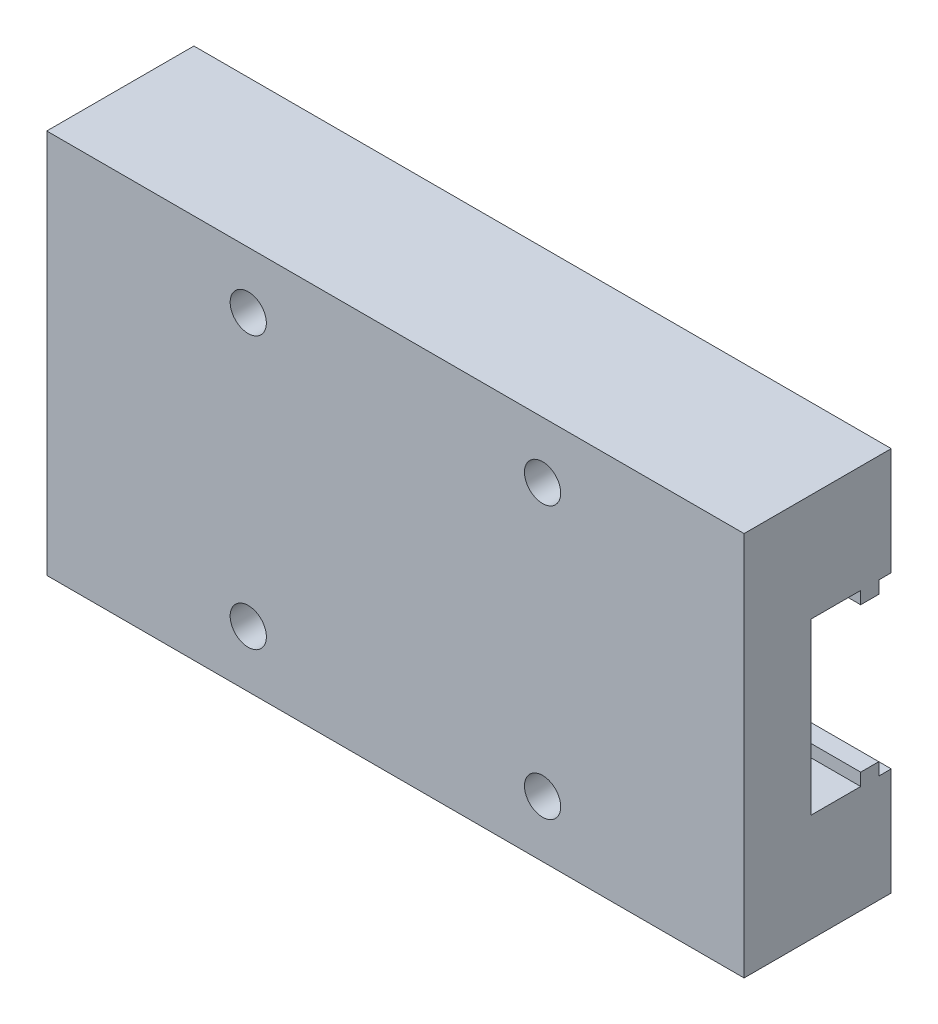
ISO-10303-21;
HEADER;
FILE_DESCRIPTION(('STEP AP214'),'2;1');
FILE_NAME('part.step','',(''),(''),'','','');
FILE_SCHEMA(('AUTOMOTIVE_DESIGN { 1 0 10303 214 1 1 1 1 }'));
ENDSEC;
DATA;
#1=APPLICATION_CONTEXT('core data for automotive mechanical design processes');
#2=APPLICATION_PROTOCOL_DEFINITION('international standard','automotive_design',2000,#1);
#3=PRODUCT_CONTEXT('',#1,'mechanical');
#4=PRODUCT('Part','Part','',(#3));
#5=PRODUCT_RELATED_PRODUCT_CATEGORY('part','',(#4));
#6=PRODUCT_DEFINITION_FORMATION('','',#4);
#7=PRODUCT_DEFINITION_CONTEXT('part definition',#1,'design');
#8=PRODUCT_DEFINITION('design','',#6,#7);
#9=PRODUCT_DEFINITION_SHAPE('','',#8);
#10=(LENGTH_UNIT() NAMED_UNIT(*) SI_UNIT(.MILLI.,.METRE.));
#11=(NAMED_UNIT(*) PLANE_ANGLE_UNIT() SI_UNIT($,.RADIAN.));
#12=(NAMED_UNIT(*) SI_UNIT($,.STERADIAN.) SOLID_ANGLE_UNIT());
#13=UNCERTAINTY_MEASURE_WITH_UNIT(LENGTH_MEASURE(1.E-05),#10,'distance_accuracy_value','');
#14=(GEOMETRIC_REPRESENTATION_CONTEXT(3) GLOBAL_UNCERTAINTY_ASSIGNED_CONTEXT((#13)) GLOBAL_UNIT_ASSIGNED_CONTEXT((#10,
#11,#12)) REPRESENTATION_CONTEXT('',''));
#15=CARTESIAN_POINT('',(0.,0.,0.));
#16=DIRECTION('',(0.,0.,1.));
#17=DIRECTION('',(1.,0.,0.));
#18=AXIS2_PLACEMENT_3D('',#15,#16,#17);
#19=CARTESIAN_POINT('',(-7.,15.25,37.45));
#20=DIRECTION('',(0.,1.,0.));
#21=DIRECTION('',(0.,0.,1.));
#22=AXIS2_PLACEMENT_3D('',#19,#20,#21);
#23=PLANE('',#22);
#24=DIRECTION('',(0.,0.,1.));
#25=VECTOR('',#24,1.);
#26=CARTESIAN_POINT('',(-6.9,15.25,40.4));
#27=LINE('',#26,#25);
#28=CARTESIAN_POINT('',(-6.9,15.25,33.9));
#29=VERTEX_POINT('',#28);
#30=CARTESIAN_POINT('',(-6.9,15.25,34.45));
#31=VERTEX_POINT('',#30);
#32=EDGE_CURVE('E221',#29,#31,#27,.T.);
#33=ORIENTED_EDGE('',*,*,#32,.T.);
#34=DIRECTION('',(1.,0.,0.));
#35=VECTOR('',#34,1.);
#36=CARTESIAN_POINT('',(-7.,15.25,34.45));
#37=LINE('',#36,#35);
#38=CARTESIAN_POINT('',(23.9,15.25,34.45));
#39=VERTEX_POINT('',#38);
#40=EDGE_CURVE('E55',#31,#39,#37,.T.);
#41=ORIENTED_EDGE('',*,*,#40,.T.);
#42=DIRECTION('',(0.,0.,-1.));
#43=VECTOR('',#42,1.);
#44=CARTESIAN_POINT('',(23.9,15.25,40.4));
#45=LINE('',#44,#43);
#46=CARTESIAN_POINT('',(23.9,15.25,33.9));
#47=VERTEX_POINT('',#46);
#48=EDGE_CURVE('E219',#39,#47,#45,.T.);
#49=ORIENTED_EDGE('',*,*,#48,.T.);
#50=DIRECTION('',(-1.,0.,0.));
#51=VECTOR('',#50,1.);
#52=CARTESIAN_POINT('',(0.,15.25,33.9));
#53=LINE('',#52,#51);
#54=EDGE_CURVE('E264',#47,#29,#53,.T.);
#55=ORIENTED_EDGE('',*,*,#54,.T.);
#56=EDGE_LOOP('',(#33,#41,#49,#55));
#57=FACE_BOUND('',#56,.T.);
#58=ADVANCED_FACE('F43',(#57),#23,.T.);
#59=CARTESIAN_POINT('',(24.,22.75,37.45));
#60=DIRECTION('',(0.,-1.,0.));
#61=DIRECTION('',(0.,0.,-1.));
#62=AXIS2_PLACEMENT_3D('',#59,#60,#61);
#63=PLANE('',#62);
#64=DIRECTION('',(0.,0.,1.));
#65=VECTOR('',#64,1.);
#66=CARTESIAN_POINT('',(23.9,22.75,40.4));
#67=LINE('',#66,#65);
#68=CARTESIAN_POINT('',(23.9,22.75,33.9));
#69=VERTEX_POINT('',#68);
#70=CARTESIAN_POINT('',(23.9,22.75,34.45));
#71=VERTEX_POINT('',#70);
#72=EDGE_CURVE('E213',#69,#71,#67,.T.);
#73=ORIENTED_EDGE('',*,*,#72,.T.);
#74=DIRECTION('',(-1.,0.,0.));
#75=VECTOR('',#74,1.);
#76=CARTESIAN_POINT('',(24.,22.75,34.45));
#77=LINE('',#76,#75);
#78=CARTESIAN_POINT('',(-6.9,22.75,34.45));
#79=VERTEX_POINT('',#78);
#80=EDGE_CURVE('E269',#71,#79,#77,.T.);
#81=ORIENTED_EDGE('',*,*,#80,.T.);
#82=DIRECTION('',(0.,0.,-1.));
#83=VECTOR('',#82,1.);
#84=CARTESIAN_POINT('',(-6.9,22.75,40.4));
#85=LINE('',#84,#83);
#86=CARTESIAN_POINT('',(-6.9,22.75,33.9));
#87=VERTEX_POINT('',#86);
#88=EDGE_CURVE('E216',#79,#87,#85,.T.);
#89=ORIENTED_EDGE('',*,*,#88,.T.);
#90=DIRECTION('',(1.,0.,0.));
#91=VECTOR('',#90,1.);
#92=CARTESIAN_POINT('',(0.,22.75,33.9));
#93=LINE('',#92,#91);
#94=EDGE_CURVE('E263',#87,#69,#93,.T.);
#95=ORIENTED_EDGE('',*,*,#94,.T.);
#96=EDGE_LOOP('',(#73,#81,#89,#95));
#97=FACE_BOUND('',#96,.T.);
#98=ADVANCED_FACE('F337',(#97),#63,.T.);
#99=CARTESIAN_POINT('',(-6.9,27.5,40.4));
#100=DIRECTION('',(1.,0.,0.));
#101=DIRECTION('',(0.,0.,-1.));
#102=AXIS2_PLACEMENT_3D('',#99,#100,#101);
#103=PLANE('',#102);
#104=ORIENTED_EDGE('',*,*,#88,.F.);
#105=DIRECTION('',(0.,-1.,0.));
#106=VECTOR('',#105,1.);
#107=CARTESIAN_POINT('',(-6.9,22.85,34.45));
#108=LINE('',#107,#106);
#109=CARTESIAN_POINT('',(-6.9,22.2,34.45));
#110=VERTEX_POINT('',#109);
#111=EDGE_CURVE('E66',#79,#110,#108,.T.);
#112=ORIENTED_EDGE('',*,*,#111,.T.);
#113=DIRECTION('',(0.,0.,-1.));
#114=VECTOR('',#113,1.);
#115=CARTESIAN_POINT('',(-6.9,22.2,35.25));
#116=LINE('',#115,#114);
#117=CARTESIAN_POINT('',(-6.9,22.2,35.25));
#118=VERTEX_POINT('',#117);
#119=EDGE_CURVE('E189',#118,#110,#116,.T.);
#120=ORIENTED_EDGE('',*,*,#119,.F.);
#121=DIRECTION('',(0.,-1.,0.));
#122=VECTOR('',#121,1.);
#123=CARTESIAN_POINT('',(-6.9,22.85,35.25));
#124=LINE('',#123,#122);
#125=CARTESIAN_POINT('',(-6.9,22.75,35.25));
#126=VERTEX_POINT('',#125);
#127=EDGE_CURVE('E199',#126,#118,#124,.T.);
#128=ORIENTED_EDGE('',*,*,#127,.F.);
#129=CARTESIAN_POINT('',(-6.9,22.75,37.45));
#130=VERTEX_POINT('',#129);
#131=EDGE_CURVE('E220',#130,#126,#85,.T.);
#132=ORIENTED_EDGE('',*,*,#131,.F.);
#133=DIRECTION('',(0.,-1.,0.));
#134=VECTOR('',#133,1.);
#135=CARTESIAN_POINT('',(-6.9,27.5,37.45));
#136=LINE('',#135,#134);
#137=CARTESIAN_POINT('',(-6.9,15.25,37.45));
#138=VERTEX_POINT('',#137);
#139=EDGE_CURVE('E230',#130,#138,#136,.T.);
#140=ORIENTED_EDGE('',*,*,#139,.T.);
#141=CARTESIAN_POINT('',(-6.9,15.25,35.25));
#142=VERTEX_POINT('',#141);
#143=EDGE_CURVE('E224',#142,#138,#27,.T.);
#144=ORIENTED_EDGE('',*,*,#143,.F.);
#145=DIRECTION('',(0.,-1.,0.));
#146=VECTOR('',#145,1.);
#147=CARTESIAN_POINT('',(-6.9,15.8,35.25));
#148=LINE('',#147,#146);
#149=CARTESIAN_POINT('',(-6.9,15.8,35.25));
#150=VERTEX_POINT('',#149);
#151=EDGE_CURVE('E167',#150,#142,#148,.T.);
#152=ORIENTED_EDGE('',*,*,#151,.F.);
#153=DIRECTION('',(0.,0.,-1.));
#154=VECTOR('',#153,1.);
#155=CARTESIAN_POINT('',(-6.9,15.8,35.25));
#156=LINE('',#155,#154);
#157=CARTESIAN_POINT('',(-6.9,15.8,34.45));
#158=VERTEX_POINT('',#157);
#159=EDGE_CURVE('E174',#150,#158,#156,.T.);
#160=ORIENTED_EDGE('',*,*,#159,.T.);
#161=DIRECTION('',(0.,-1.,0.));
#162=VECTOR('',#161,1.);
#163=CARTESIAN_POINT('',(-6.9,15.8,34.45));
#164=LINE('',#163,#162);
#165=EDGE_CURVE('E181',#158,#31,#164,.T.);
#166=ORIENTED_EDGE('',*,*,#165,.T.);
#167=ORIENTED_EDGE('',*,*,#32,.F.);
#168=DIRECTION('',(0.,-1.,0.));
#169=VECTOR('',#168,1.);
#170=CARTESIAN_POINT('',(-6.9,27.5,33.9));
#171=LINE('',#170,#169);
#172=CARTESIAN_POINT('',(-6.9,10.5,33.9));
#173=VERTEX_POINT('',#172);
#174=EDGE_CURVE('E226',#29,#173,#171,.T.);
#175=ORIENTED_EDGE('',*,*,#174,.T.);
#176=DIRECTION('',(0.,0.,-1.));
#177=VECTOR('',#176,1.);
#178=CARTESIAN_POINT('',(-6.9,10.5,40.4));
#179=LINE('',#178,#177);
#180=CARTESIAN_POINT('',(-6.9,10.5,40.4));
#181=VERTEX_POINT('',#180);
#182=EDGE_CURVE('E257',#181,#173,#179,.T.);
#183=ORIENTED_EDGE('',*,*,#182,.F.);
#184=DIRECTION('',(0.,-1.,0.));
#185=VECTOR('',#184,1.);
#186=CARTESIAN_POINT('',(-6.9,27.5,40.4));
#187=LINE('',#186,#185);
#188=CARTESIAN_POINT('',(-6.9,27.5,40.4));
#189=VERTEX_POINT('',#188);
#190=EDGE_CURVE('E233',#189,#181,#187,.T.);
#191=ORIENTED_EDGE('',*,*,#190,.F.);
#192=DIRECTION('',(0.,0.,-1.));
#193=VECTOR('',#192,1.);
#194=CARTESIAN_POINT('',(-6.9,27.5,40.4));
#195=LINE('',#194,#193);
#196=CARTESIAN_POINT('',(-6.9,27.5,33.9));
#197=VERTEX_POINT('',#196);
#198=EDGE_CURVE('E242',#189,#197,#195,.T.);
#199=ORIENTED_EDGE('',*,*,#198,.T.);
#200=EDGE_CURVE('E245',#197,#87,#171,.T.);
#201=ORIENTED_EDGE('',*,*,#200,.T.);
#202=EDGE_LOOP('',(#104,#112,#120,#128,#132,#140,#144,#152,#160,#166,#167,#175,#183,#191,#199,#201));
#203=FACE_BOUND('',#202,.T.);
#204=ADVANCED_FACE('F44',(#203),#103,.F.);
#205=CARTESIAN_POINT('',(23.9,10.5,40.4));
#206=DIRECTION('',(-1.,0.,0.));
#207=DIRECTION('',(0.,0.,1.));
#208=AXIS2_PLACEMENT_3D('',#205,#206,#207);
#209=PLANE('',#208);
#210=ORIENTED_EDGE('',*,*,#48,.F.);
#211=DIRECTION('',(0.,1.,0.));
#212=VECTOR('',#211,1.);
#213=CARTESIAN_POINT('',(23.9,15.15,34.45));
#214=LINE('',#213,#212);
#215=CARTESIAN_POINT('',(23.9,15.8,34.45));
#216=VERTEX_POINT('',#215);
#217=EDGE_CURVE('E58',#39,#216,#214,.T.);
#218=ORIENTED_EDGE('',*,*,#217,.T.);
#219=DIRECTION('',(0.,0.,-1.));
#220=VECTOR('',#219,1.);
#221=CARTESIAN_POINT('',(23.9,15.8,35.25));
#222=LINE('',#221,#220);
#223=CARTESIAN_POINT('',(23.9,15.8,35.25));
#224=VERTEX_POINT('',#223);
#225=EDGE_CURVE('E166',#224,#216,#222,.T.);
#226=ORIENTED_EDGE('',*,*,#225,.F.);
#227=DIRECTION('',(0.,1.,0.));
#228=VECTOR('',#227,1.);
#229=CARTESIAN_POINT('',(23.9,15.15,35.25));
#230=LINE('',#229,#228);
#231=CARTESIAN_POINT('',(23.9,15.25,35.25));
#232=VERTEX_POINT('',#231);
#233=EDGE_CURVE('E156',#232,#224,#230,.T.);
#234=ORIENTED_EDGE('',*,*,#233,.F.);
#235=CARTESIAN_POINT('',(23.9,15.25,37.45));
#236=VERTEX_POINT('',#235);
#237=EDGE_CURVE('E222',#236,#232,#45,.T.);
#238=ORIENTED_EDGE('',*,*,#237,.F.);
#239=DIRECTION('',(0.,1.,0.));
#240=VECTOR('',#239,1.);
#241=CARTESIAN_POINT('',(23.9,10.5,37.45));
#242=LINE('',#241,#240);
#243=CARTESIAN_POINT('',(23.9,22.75,37.45));
#244=VERTEX_POINT('',#243);
#245=EDGE_CURVE('E270',#236,#244,#242,.T.);
#246=ORIENTED_EDGE('',*,*,#245,.T.);
#247=CARTESIAN_POINT('',(23.9,22.75,35.25));
#248=VERTEX_POINT('',#247);
#249=EDGE_CURVE('E215',#248,#244,#67,.T.);
#250=ORIENTED_EDGE('',*,*,#249,.F.);
#251=DIRECTION('',(0.,1.,0.));
#252=VECTOR('',#251,1.);
#253=CARTESIAN_POINT('',(23.9,22.2,35.25));
#254=LINE('',#253,#252);
#255=CARTESIAN_POINT('',(23.9,22.2,35.25));
#256=VERTEX_POINT('',#255);
#257=EDGE_CURVE('E194',#256,#248,#254,.T.);
#258=ORIENTED_EDGE('',*,*,#257,.F.);
#259=DIRECTION('',(0.,0.,-1.));
#260=VECTOR('',#259,1.);
#261=CARTESIAN_POINT('',(23.9,22.2,35.25));
#262=LINE('',#261,#260);
#263=CARTESIAN_POINT('',(23.9,22.2,34.45));
#264=VERTEX_POINT('',#263);
#265=EDGE_CURVE('E195',#256,#264,#262,.T.);
#266=ORIENTED_EDGE('',*,*,#265,.T.);
#267=DIRECTION('',(0.,1.,0.));
#268=VECTOR('',#267,1.);
#269=CARTESIAN_POINT('',(23.9,22.2,34.45));
#270=LINE('',#269,#268);
#271=EDGE_CURVE('E198',#264,#71,#270,.T.);
#272=ORIENTED_EDGE('',*,*,#271,.T.);
#273=ORIENTED_EDGE('',*,*,#72,.F.);
#274=DIRECTION('',(0.,1.,0.));
#275=VECTOR('',#274,1.);
#276=CARTESIAN_POINT('',(23.9,10.5,33.9));
#277=LINE('',#276,#275);
#278=CARTESIAN_POINT('',(23.9,27.5,33.9));
#279=VERTEX_POINT('',#278);
#280=EDGE_CURVE('E250',#69,#279,#277,.T.);
#281=ORIENTED_EDGE('',*,*,#280,.T.);
#282=DIRECTION('',(0.,0.,-1.));
#283=VECTOR('',#282,1.);
#284=CARTESIAN_POINT('',(23.9,27.5,40.4));
#285=LINE('',#284,#283);
#286=CARTESIAN_POINT('',(23.9,27.5,40.4));
#287=VERTEX_POINT('',#286);
#288=EDGE_CURVE('E255',#287,#279,#285,.T.);
#289=ORIENTED_EDGE('',*,*,#288,.F.);
#290=DIRECTION('',(0.,1.,0.));
#291=VECTOR('',#290,1.);
#292=CARTESIAN_POINT('',(23.9,10.5,40.4));
#293=LINE('',#292,#291);
#294=CARTESIAN_POINT('',(23.9,10.5,40.4));
#295=VERTEX_POINT('',#294);
#296=EDGE_CURVE('E240',#295,#287,#293,.T.);
#297=ORIENTED_EDGE('',*,*,#296,.F.);
#298=DIRECTION('',(0.,0.,-1.));
#299=VECTOR('',#298,1.);
#300=CARTESIAN_POINT('',(23.9,10.5,40.4));
#301=LINE('',#300,#299);
#302=CARTESIAN_POINT('',(23.9,10.5,33.9));
#303=VERTEX_POINT('',#302);
#304=EDGE_CURVE('E260',#295,#303,#301,.T.);
#305=ORIENTED_EDGE('',*,*,#304,.T.);
#306=EDGE_CURVE('E246',#303,#47,#277,.T.);
#307=ORIENTED_EDGE('',*,*,#306,.T.);
#308=EDGE_LOOP('',(#210,#218,#226,#234,#238,#246,#250,#258,#266,#272,#273,#281,#289,#297,#305,#307));
#309=FACE_BOUND('',#308,.T.);
#310=ADVANCED_FACE('F172',(#309),#209,.F.);
#311=CARTESIAN_POINT('',(0.,0.,33.9));
#312=DIRECTION('',(0.,0.,1.));
#313=DIRECTION('',(1.,0.,0.));
#314=AXIS2_PLACEMENT_3D('',#311,#312,#313);
#315=PLANE('',#314);
#316=ORIENTED_EDGE('',*,*,#54,.F.);
#317=ORIENTED_EDGE('',*,*,#306,.F.);
#318=DIRECTION('',(1.,0.,0.));
#319=VECTOR('',#318,1.);
#320=CARTESIAN_POINT('',(-6.9,10.5,33.9));
#321=LINE('',#320,#319);
#322=EDGE_CURVE('E241',#173,#303,#321,.T.);
#323=ORIENTED_EDGE('',*,*,#322,.F.);
#324=ORIENTED_EDGE('',*,*,#174,.F.);
#325=EDGE_LOOP('',(#316,#317,#323,#324));
#326=FACE_BOUND('',#325,.T.);
#327=ADVANCED_FACE('F357',(#326),#315,.F.);
#328=ORIENTED_EDGE('',*,*,#94,.F.);
#329=ORIENTED_EDGE('',*,*,#200,.F.);
#330=DIRECTION('',(-1.,0.,0.));
#331=VECTOR('',#330,1.);
#332=CARTESIAN_POINT('',(23.9,27.5,33.9));
#333=LINE('',#332,#331);
#334=EDGE_CURVE('E234',#279,#197,#333,.T.);
#335=ORIENTED_EDGE('',*,*,#334,.F.);
#336=ORIENTED_EDGE('',*,*,#280,.F.);
#337=EDGE_LOOP('',(#328,#329,#335,#336));
#338=FACE_BOUND('',#337,.T.);
#339=ADVANCED_FACE('F336',(#338),#315,.F.);
#340=CARTESIAN_POINT('',(-6.9,10.5,40.4));
#341=DIRECTION('',(0.,1.,0.));
#342=DIRECTION('',(0.,0.,1.));
#343=AXIS2_PLACEMENT_3D('',#340,#341,#342);
#344=PLANE('',#343);
#345=ORIENTED_EDGE('',*,*,#322,.T.);
#346=ORIENTED_EDGE('',*,*,#304,.F.);
#347=DIRECTION('',(1.,0.,0.));
#348=VECTOR('',#347,1.);
#349=CARTESIAN_POINT('',(-6.9,10.5,40.4));
#350=LINE('',#349,#348);
#351=EDGE_CURVE('E232',#181,#295,#350,.T.);
#352=ORIENTED_EDGE('',*,*,#351,.F.);
#353=ORIENTED_EDGE('',*,*,#182,.T.);
#354=EDGE_LOOP('',(#345,#346,#352,#353));
#355=FACE_BOUND('',#354,.T.);
#356=ADVANCED_FACE('F354',(#355),#344,.F.);
#357=CARTESIAN_POINT('',(23.9,27.5,40.4));
#358=DIRECTION('',(0.,-1.,0.));
#359=DIRECTION('',(0.,0.,-1.));
#360=AXIS2_PLACEMENT_3D('',#357,#358,#359);
#361=PLANE('',#360);
#362=ORIENTED_EDGE('',*,*,#334,.T.);
#363=ORIENTED_EDGE('',*,*,#198,.F.);
#364=DIRECTION('',(-1.,0.,0.));
#365=VECTOR('',#364,1.);
#366=CARTESIAN_POINT('',(23.9,27.5,40.4));
#367=LINE('',#366,#365);
#368=EDGE_CURVE('E239',#287,#189,#367,.T.);
#369=ORIENTED_EDGE('',*,*,#368,.F.);
#370=ORIENTED_EDGE('',*,*,#288,.T.);
#371=EDGE_LOOP('',(#362,#363,#369,#370));
#372=FACE_BOUND('',#371,.T.);
#373=ADVANCED_FACE('F350',(#372),#361,.F.);
#374=CARTESIAN_POINT('',(0.,0.,40.4));
#375=DIRECTION('',(0.,0.,1.));
#376=DIRECTION('',(1.,0.,0.));
#377=AXIS2_PLACEMENT_3D('',#374,#375,#376);
#378=PLANE('',#377);
#379=CARTESIAN_POINT('',(2.,25.,40.4));
#380=DIRECTION('',(0.,0.,1.));
#381=DIRECTION('',(1.,0.,0.));
#382=AXIS2_PLACEMENT_3D('',#379,#380,#381);
#383=CIRCLE('',#382,0.8);
#384=CARTESIAN_POINT('',(2.8,25.,40.4));
#385=VERTEX_POINT('',#384);
#386=EDGE_CURVE('E50',#385,#385,#383,.F.);
#387=ORIENTED_EDGE('',*,*,#386,.T.);
#388=EDGE_LOOP('',(#387));
#389=FACE_BOUND('',#388,.T.);
#390=CARTESIAN_POINT('',(15.,13.,40.4));
#391=DIRECTION('',(0.,0.,1.));
#392=DIRECTION('',(1.,0.,0.));
#393=AXIS2_PLACEMENT_3D('',#390,#391,#392);
#394=CIRCLE('',#393,0.799999999999999);
#395=CARTESIAN_POINT('',(15.8,13.,40.4));
#396=VERTEX_POINT('',#395);
#397=EDGE_CURVE('E282',#396,#396,#394,.F.);
#398=ORIENTED_EDGE('',*,*,#397,.T.);
#399=EDGE_LOOP('',(#398));
#400=FACE_BOUND('',#399,.T.);
#401=CARTESIAN_POINT('',(15.,25.,40.4));
#402=DIRECTION('',(0.,0.,1.));
#403=DIRECTION('',(1.,0.,0.));
#404=AXIS2_PLACEMENT_3D('',#401,#402,#403);
#405=CIRCLE('',#404,0.799999999999999);
#406=CARTESIAN_POINT('',(15.8,25.,40.4));
#407=VERTEX_POINT('',#406);
#408=EDGE_CURVE('E279',#407,#407,#405,.F.);
#409=ORIENTED_EDGE('',*,*,#408,.T.);
#410=EDGE_LOOP('',(#409));
#411=FACE_BOUND('',#410,.T.);
#412=CARTESIAN_POINT('',(2.,13.,40.4));
#413=DIRECTION('',(0.,0.,1.));
#414=DIRECTION('',(1.,0.,0.));
#415=AXIS2_PLACEMENT_3D('',#412,#413,#414);
#416=CIRCLE('',#415,0.8);
#417=CARTESIAN_POINT('',(2.8,13.,40.4));
#418=VERTEX_POINT('',#417);
#419=EDGE_CURVE('E274',#418,#418,#416,.F.);
#420=ORIENTED_EDGE('',*,*,#419,.T.);
#421=EDGE_LOOP('',(#420));
#422=FACE_BOUND('',#421,.T.);
#423=ORIENTED_EDGE('',*,*,#190,.T.);
#424=ORIENTED_EDGE('',*,*,#351,.T.);
#425=ORIENTED_EDGE('',*,*,#296,.T.);
#426=ORIENTED_EDGE('',*,*,#368,.T.);
#427=EDGE_LOOP('',(#423,#424,#425,#426));
#428=FACE_BOUND('',#427,.T.);
#429=ADVANCED_FACE('F286',(#389,#400,#411,#422,#428),#378,.T.);
#430=CARTESIAN_POINT('',(0.,0.,37.45));
#431=DIRECTION('',(0.,0.,1.));
#432=DIRECTION('',(1.,0.,0.));
#433=AXIS2_PLACEMENT_3D('',#430,#431,#432);
#434=PLANE('',#433);
#435=DIRECTION('',(-1.,0.,0.));
#436=VECTOR('',#435,1.);
#437=CARTESIAN_POINT('',(24.,22.75,37.45));
#438=LINE('',#437,#436);
#439=EDGE_CURVE('E207',#244,#130,#438,.T.);
#440=ORIENTED_EDGE('',*,*,#439,.F.);
#441=ORIENTED_EDGE('',*,*,#245,.F.);
#442=DIRECTION('',(1.,0.,0.));
#443=VECTOR('',#442,1.);
#444=CARTESIAN_POINT('',(-7.,15.25,37.45));
#445=LINE('',#444,#443);
#446=EDGE_CURVE('E173',#138,#236,#445,.T.);
#447=ORIENTED_EDGE('',*,*,#446,.F.);
#448=ORIENTED_EDGE('',*,*,#139,.F.);
#449=EDGE_LOOP('',(#440,#441,#447,#448));
#450=FACE_BOUND('',#449,.T.);
#451=ADVANCED_FACE('F318',(#450),#434,.F.);
#452=DIRECTION('',(1.,0.,0.));
#453=VECTOR('',#452,1.);
#454=CARTESIAN_POINT('',(-7.,15.25,35.25));
#455=LINE('',#454,#453);
#456=EDGE_CURVE('E11',#142,#232,#455,.T.);
#457=ORIENTED_EDGE('',*,*,#456,.F.);
#458=ORIENTED_EDGE('',*,*,#143,.T.);
#459=ORIENTED_EDGE('',*,*,#446,.T.);
#460=ORIENTED_EDGE('',*,*,#237,.T.);
#461=EDGE_LOOP('',(#457,#458,#459,#460));
#462=FACE_BOUND('',#461,.T.);
#463=ADVANCED_FACE('F313',(#462),#23,.T.);
#464=DIRECTION('',(-1.,0.,0.));
#465=VECTOR('',#464,1.);
#466=CARTESIAN_POINT('',(24.,22.75,35.25));
#467=LINE('',#466,#465);
#468=EDGE_CURVE('E275',#248,#126,#467,.T.);
#469=ORIENTED_EDGE('',*,*,#468,.F.);
#470=ORIENTED_EDGE('',*,*,#249,.T.);
#471=ORIENTED_EDGE('',*,*,#439,.T.);
#472=ORIENTED_EDGE('',*,*,#131,.T.);
#473=EDGE_LOOP('',(#469,#470,#471,#472));
#474=FACE_BOUND('',#473,.T.);
#475=ADVANCED_FACE('F321',(#474),#63,.T.);
#476=CARTESIAN_POINT('',(-6.9,22.2,35.25));
#477=DIRECTION('',(0.,1.,0.));
#478=DIRECTION('',(0.,0.,1.));
#479=AXIS2_PLACEMENT_3D('',#476,#477,#478);
#480=PLANE('',#479);
#481=DIRECTION('',(1.,0.,0.));
#482=VECTOR('',#481,1.);
#483=CARTESIAN_POINT('',(-6.9,22.2,34.45));
#484=LINE('',#483,#482);
#485=EDGE_CURVE('E200',#110,#264,#484,.T.);
#486=ORIENTED_EDGE('',*,*,#485,.T.);
#487=ORIENTED_EDGE('',*,*,#265,.F.);
#488=DIRECTION('',(1.,0.,0.));
#489=VECTOR('',#488,1.);
#490=CARTESIAN_POINT('',(-6.9,22.2,35.25));
#491=LINE('',#490,#489);
#492=EDGE_CURVE('E204',#118,#256,#491,.T.);
#493=ORIENTED_EDGE('',*,*,#492,.F.);
#494=ORIENTED_EDGE('',*,*,#119,.T.);
#495=EDGE_LOOP('',(#486,#487,#493,#494));
#496=FACE_BOUND('',#495,.T.);
#497=ADVANCED_FACE('F332',(#496),#480,.F.);
#498=CARTESIAN_POINT('',(0.,0.,35.25));
#499=DIRECTION('',(0.,0.,1.));
#500=DIRECTION('',(1.,0.,0.));
#501=AXIS2_PLACEMENT_3D('',#498,#499,#500);
#502=PLANE('',#501);
#503=ORIENTED_EDGE('',*,*,#257,.T.);
#504=ORIENTED_EDGE('',*,*,#468,.T.);
#505=ORIENTED_EDGE('',*,*,#127,.T.);
#506=ORIENTED_EDGE('',*,*,#492,.T.);
#507=EDGE_LOOP('',(#503,#504,#505,#506));
#508=FACE_BOUND('',#507,.T.);
#509=ADVANCED_FACE('F330',(#508),#502,.T.);
#510=CARTESIAN_POINT('',(0.,0.,34.45));
#511=DIRECTION('',(0.,0.,1.));
#512=DIRECTION('',(1.,0.,0.));
#513=AXIS2_PLACEMENT_3D('',#510,#511,#512);
#514=PLANE('',#513);
#515=ORIENTED_EDGE('',*,*,#80,.F.);
#516=ORIENTED_EDGE('',*,*,#271,.F.);
#517=ORIENTED_EDGE('',*,*,#485,.F.);
#518=ORIENTED_EDGE('',*,*,#111,.F.);
#519=EDGE_LOOP('',(#515,#516,#517,#518));
#520=FACE_BOUND('',#519,.T.);
#521=ADVANCED_FACE('F335',(#520),#514,.F.);
#522=CARTESIAN_POINT('',(23.9,15.8,35.25));
#523=DIRECTION('',(0.,-1.,0.));
#524=DIRECTION('',(0.,0.,-1.));
#525=AXIS2_PLACEMENT_3D('',#522,#523,#524);
#526=PLANE('',#525);
#527=DIRECTION('',(-1.,0.,0.));
#528=VECTOR('',#527,1.);
#529=CARTESIAN_POINT('',(23.9,15.8,34.45));
#530=LINE('',#529,#528);
#531=EDGE_CURVE('E190',#216,#158,#530,.T.);
#532=ORIENTED_EDGE('',*,*,#531,.T.);
#533=ORIENTED_EDGE('',*,*,#159,.F.);
#534=DIRECTION('',(-1.,0.,0.));
#535=VECTOR('',#534,1.);
#536=CARTESIAN_POINT('',(23.9,15.8,35.25));
#537=LINE('',#536,#535);
#538=EDGE_CURVE('E159',#224,#150,#537,.T.);
#539=ORIENTED_EDGE('',*,*,#538,.F.);
#540=ORIENTED_EDGE('',*,*,#225,.T.);
#541=EDGE_LOOP('',(#532,#533,#539,#540));
#542=FACE_BOUND('',#541,.T.);
#543=ADVANCED_FACE('F178',(#542),#526,.F.);
#544=CARTESIAN_POINT('',(0.,0.,35.25));
#545=DIRECTION('',(0.,0.,1.));
#546=DIRECTION('',(1.,0.,0.));
#547=AXIS2_PLACEMENT_3D('',#544,#545,#546);
#548=PLANE('',#547);
#549=ORIENTED_EDGE('',*,*,#151,.T.);
#550=ORIENTED_EDGE('',*,*,#456,.T.);
#551=ORIENTED_EDGE('',*,*,#233,.T.);
#552=ORIENTED_EDGE('',*,*,#538,.T.);
#553=EDGE_LOOP('',(#549,#550,#551,#552));
#554=FACE_BOUND('',#553,.T.);
#555=ADVANCED_FACE('F158',(#554),#548,.T.);
#556=CARTESIAN_POINT('',(0.,0.,34.45));
#557=DIRECTION('',(0.,0.,1.));
#558=DIRECTION('',(1.,0.,0.));
#559=AXIS2_PLACEMENT_3D('',#556,#557,#558);
#560=PLANE('',#559);
#561=ORIENTED_EDGE('',*,*,#40,.F.);
#562=ORIENTED_EDGE('',*,*,#165,.F.);
#563=ORIENTED_EDGE('',*,*,#531,.F.);
#564=ORIENTED_EDGE('',*,*,#217,.F.);
#565=EDGE_LOOP('',(#561,#562,#563,#564));
#566=FACE_BOUND('',#565,.T.);
#567=ADVANCED_FACE('F361',(#566),#560,.F.);
#568=CARTESIAN_POINT('',(2.,13.,40.5));
#569=DIRECTION('',(0.,0.,-1.));
#570=DIRECTION('',(-1.,0.,0.));
#571=AXIS2_PLACEMENT_3D('',#568,#569,#570);
#572=CYLINDRICAL_SURFACE('',#571,0.8);
#573=ORIENTED_EDGE('',*,*,#419,.F.);
#574=EDGE_LOOP('',(#573));
#575=FACE_BOUND('',#574,.T.);
#576=CARTESIAN_POINT('',(2.,13.,37.9));
#577=DIRECTION('',(0.,0.,1.));
#578=DIRECTION('',(1.,0.,0.));
#579=AXIS2_PLACEMENT_3D('',#576,#577,#578);
#580=CIRCLE('',#579,0.8);
#581=CARTESIAN_POINT('',(2.8,13.,37.9));
#582=VERTEX_POINT('',#581);
#583=EDGE_CURVE('E276',#582,#582,#580,.T.);
#584=ORIENTED_EDGE('',*,*,#583,.F.);
#585=EDGE_LOOP('',(#584));
#586=FACE_BOUND('',#585,.T.);
#587=ADVANCED_FACE('F364',(#575,#586),#572,.F.);
#588=CARTESIAN_POINT('',(2.,13.,37.9));
#589=DIRECTION('',(0.,0.,1.));
#590=DIRECTION('',(1.,0.,0.));
#591=AXIS2_PLACEMENT_3D('',#588,#589,#590);
#592=PLANE('',#591);
#593=ORIENTED_EDGE('',*,*,#583,.T.);
#594=EDGE_LOOP('',(#593));
#595=FACE_BOUND('',#594,.T.);
#596=ADVANCED_FACE('F375',(#595),#592,.T.);
#597=CARTESIAN_POINT('',(15.,25.,40.5));
#598=DIRECTION('',(0.,0.,-1.));
#599=DIRECTION('',(-1.,0.,0.));
#600=AXIS2_PLACEMENT_3D('',#597,#598,#599);
#601=CYLINDRICAL_SURFACE('',#600,0.799999999999999);
#602=ORIENTED_EDGE('',*,*,#408,.F.);
#603=EDGE_LOOP('',(#602));
#604=FACE_BOUND('',#603,.T.);
#605=CARTESIAN_POINT('',(15.,25.,37.9));
#606=DIRECTION('',(0.,0.,1.));
#607=DIRECTION('',(1.,0.,0.));
#608=AXIS2_PLACEMENT_3D('',#605,#606,#607);
#609=CIRCLE('',#608,0.799999999999999);
#610=CARTESIAN_POINT('',(15.8,25.,37.9));
#611=VERTEX_POINT('',#610);
#612=EDGE_CURVE('E304',#611,#611,#609,.T.);
#613=ORIENTED_EDGE('',*,*,#612,.F.);
#614=EDGE_LOOP('',(#613));
#615=FACE_BOUND('',#614,.T.);
#616=ADVANCED_FACE('F429',(#604,#615),#601,.F.);
#617=CARTESIAN_POINT('',(15.,25.,37.9));
#618=DIRECTION('',(0.,0.,1.));
#619=DIRECTION('',(1.,0.,0.));
#620=AXIS2_PLACEMENT_3D('',#617,#618,#619);
#621=PLANE('',#620);
#622=ORIENTED_EDGE('',*,*,#612,.T.);
#623=EDGE_LOOP('',(#622));
#624=FACE_BOUND('',#623,.T.);
#625=ADVANCED_FACE('F439',(#624),#621,.T.);
#626=CARTESIAN_POINT('',(15.,13.,40.5));
#627=DIRECTION('',(0.,0.,-1.));
#628=DIRECTION('',(-1.,0.,0.));
#629=AXIS2_PLACEMENT_3D('',#626,#627,#628);
#630=CYLINDRICAL_SURFACE('',#629,0.799999999999999);
#631=ORIENTED_EDGE('',*,*,#397,.F.);
#632=EDGE_LOOP('',(#631));
#633=FACE_BOUND('',#632,.T.);
#634=CARTESIAN_POINT('',(15.,13.,37.9));
#635=DIRECTION('',(0.,0.,1.));
#636=DIRECTION('',(1.,0.,0.));
#637=AXIS2_PLACEMENT_3D('',#634,#635,#636);
#638=CIRCLE('',#637,0.799999999999999);
#639=CARTESIAN_POINT('',(15.8,13.,37.9));
#640=VERTEX_POINT('',#639);
#641=EDGE_CURVE('E296',#640,#640,#638,.T.);
#642=ORIENTED_EDGE('',*,*,#641,.F.);
#643=EDGE_LOOP('',(#642));
#644=FACE_BOUND('',#643,.T.);
#645=ADVANCED_FACE('F446',(#633,#644),#630,.F.);
#646=CARTESIAN_POINT('',(15.,13.,37.9));
#647=DIRECTION('',(0.,0.,1.));
#648=DIRECTION('',(1.,0.,0.));
#649=AXIS2_PLACEMENT_3D('',#646,#647,#648);
#650=PLANE('',#649);
#651=ORIENTED_EDGE('',*,*,#641,.T.);
#652=EDGE_LOOP('',(#651));
#653=FACE_BOUND('',#652,.T.);
#654=ADVANCED_FACE('F294',(#653),#650,.T.);
#655=CARTESIAN_POINT('',(2.,25.,40.5));
#656=DIRECTION('',(0.,0.,-1.));
#657=DIRECTION('',(-1.,0.,0.));
#658=AXIS2_PLACEMENT_3D('',#655,#656,#657);
#659=CYLINDRICAL_SURFACE('',#658,0.8);
#660=ORIENTED_EDGE('',*,*,#386,.F.);
#661=EDGE_LOOP('',(#660));
#662=FACE_BOUND('',#661,.T.);
#663=CARTESIAN_POINT('',(2.,25.,37.9));
#664=DIRECTION('',(0.,0.,1.));
#665=DIRECTION('',(1.,0.,0.));
#666=AXIS2_PLACEMENT_3D('',#663,#664,#665);
#667=CIRCLE('',#666,0.8);
#668=CARTESIAN_POINT('',(2.8,25.,37.9));
#669=VERTEX_POINT('',#668);
#670=EDGE_CURVE('E298',#669,#669,#667,.T.);
#671=ORIENTED_EDGE('',*,*,#670,.F.);
#672=EDGE_LOOP('',(#671));
#673=FACE_BOUND('',#672,.T.);
#674=ADVANCED_FACE('F289',(#662,#673),#659,.F.);
#675=CARTESIAN_POINT('',(2.,25.,37.9));
#676=DIRECTION('',(0.,0.,1.));
#677=DIRECTION('',(1.,0.,0.));
#678=AXIS2_PLACEMENT_3D('',#675,#676,#677);
#679=PLANE('',#678);
#680=ORIENTED_EDGE('',*,*,#670,.T.);
#681=EDGE_LOOP('',(#680));
#682=FACE_BOUND('',#681,.T.);
#683=ADVANCED_FACE('F291',(#682),#679,.T.);
#684=CLOSED_SHELL('',(#58,#98,#204,#310,#327,#339,#356,#373,#429,#451,#463,#475,#497,#509,#521,
#543,#555,#567,#587,#596,#616,#625,#645,#654,#674,#683));
#685=MANIFOLD_SOLID_BREP('B2',#684);
#686=ADVANCED_BREP_SHAPE_REPRESENTATION('',(#18,#685),#14);
#687=SHAPE_DEFINITION_REPRESENTATION(#9,#686);
ENDSEC;
END-ISO-10303-21;
